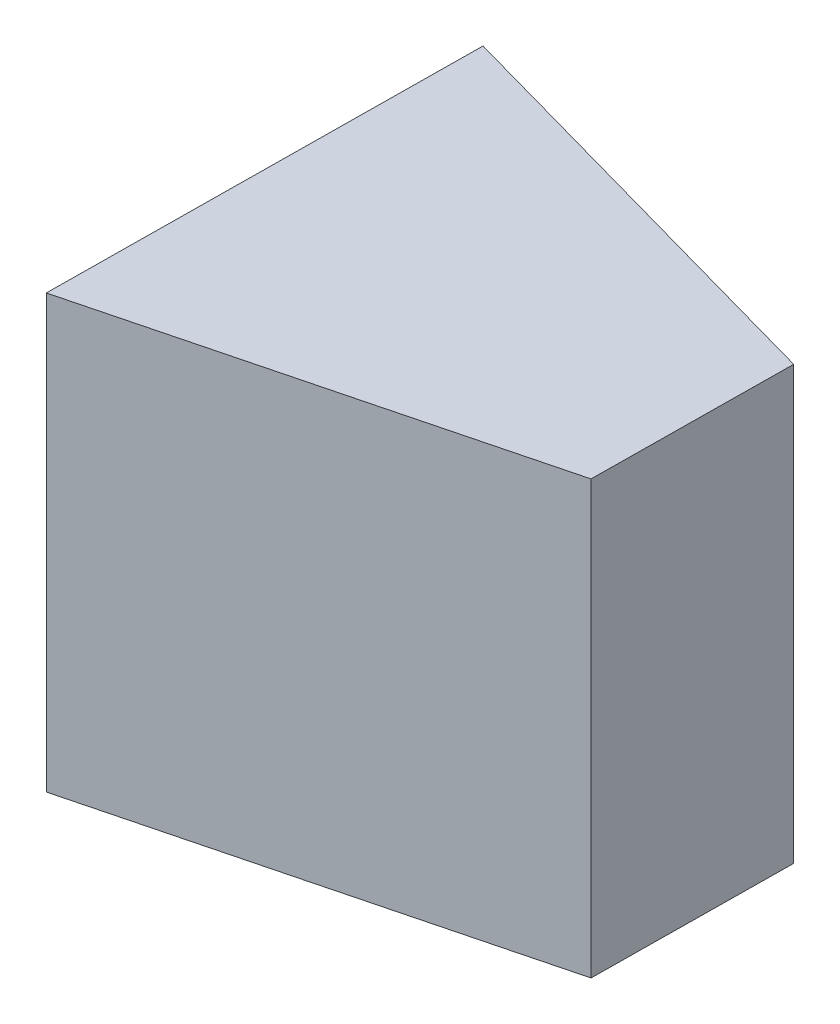
ISO-10303-21;
HEADER;
FILE_DESCRIPTION(('STEP AP214'),'2;1');
FILE_NAME('part.step','',(''),(''),'','','');
FILE_SCHEMA(('AUTOMOTIVE_DESIGN { 1 0 10303 214 1 1 1 1 }'));
ENDSEC;
DATA;
#1=APPLICATION_CONTEXT('core data for automotive mechanical design processes');
#2=APPLICATION_PROTOCOL_DEFINITION('international standard','automotive_design',2000,#1);
#3=PRODUCT_CONTEXT('',#1,'mechanical');
#4=PRODUCT('Part','Part','',(#3));
#5=PRODUCT_RELATED_PRODUCT_CATEGORY('part','',(#4));
#6=PRODUCT_DEFINITION_FORMATION('','',#4);
#7=PRODUCT_DEFINITION_CONTEXT('part definition',#1,'design');
#8=PRODUCT_DEFINITION('design','',#6,#7);
#9=PRODUCT_DEFINITION_SHAPE('','',#8);
#10=(LENGTH_UNIT() NAMED_UNIT(*) SI_UNIT(.MILLI.,.METRE.));
#11=(NAMED_UNIT(*) PLANE_ANGLE_UNIT() SI_UNIT($,.RADIAN.));
#12=(NAMED_UNIT(*) SI_UNIT($,.STERADIAN.) SOLID_ANGLE_UNIT());
#13=UNCERTAINTY_MEASURE_WITH_UNIT(LENGTH_MEASURE(1.E-05),#10,'distance_accuracy_value','');
#14=(GEOMETRIC_REPRESENTATION_CONTEXT(3) GLOBAL_UNCERTAINTY_ASSIGNED_CONTEXT((#13)) GLOBAL_UNIT_ASSIGNED_CONTEXT((#10,
#11,#12)) REPRESENTATION_CONTEXT('',''));
#15=CARTESIAN_POINT('',(0.,0.,0.));
#16=DIRECTION('',(0.,0.,1.));
#17=DIRECTION('',(1.,0.,0.));
#18=AXIS2_PLACEMENT_3D('',#15,#16,#17);
#19=CARTESIAN_POINT('',(24.7376919873646,50.,25.2595842233849));
#20=DIRECTION('',(-0.999945524214991,0.,-0.010437844720407));
#21=DIRECTION('',(-0.010437844720407,0.,0.999945524214991));
#22=AXIS2_PLACEMENT_3D('',#19,#20,#21);
#23=PLANE('',#22);
#24=DIRECTION('',(0.010437844720407,0.,-0.999945524214991));
#25=VECTOR('',#24,1.);
#26=CARTESIAN_POINT('',(24.7376919873646,0.,25.2595842233849));
#27=LINE('',#26,#25);
#28=CARTESIAN_POINT('',(24.8775325905423,0.,11.8628544389588));
#29=VERTEX_POINT('',#28);
#30=CARTESIAN_POINT('',(25.1197436202072,0.,-11.3409622029385));
#31=VERTEX_POINT('',#30);
#32=EDGE_CURVE('E103',#29,#31,#27,.T.);
#33=ORIENTED_EDGE('',*,*,#32,.T.);
#34=DIRECTION('',(0.,1.,0.));
#35=VECTOR('',#34,1.);
#36=CARTESIAN_POINT('',(25.1197436202072,50.,-11.3409622029385));
#37=LINE('',#36,#35);
#38=CARTESIAN_POINT('',(25.1197436202072,50.,-11.3409622029385));
#39=VERTEX_POINT('',#38);
#40=EDGE_CURVE('E11',#39,#31,#37,.F.);
#41=ORIENTED_EDGE('',*,*,#40,.F.);
#42=DIRECTION('',(0.010437844720407,0.,-0.999945524214991));
#43=VECTOR('',#42,1.);
#44=CARTESIAN_POINT('',(24.7376919873646,50.,25.2595842233849));
#45=LINE('',#44,#43);
#46=CARTESIAN_POINT('',(24.8775325905423,50.,11.8628544389588));
#47=VERTEX_POINT('',#46);
#48=EDGE_CURVE('E83',#47,#39,#45,.T.);
#49=ORIENTED_EDGE('',*,*,#48,.F.);
#50=DIRECTION('',(0.,1.,0.));
#51=VECTOR('',#50,1.);
#52=CARTESIAN_POINT('',(24.8775325905423,50.,11.8628544389588));
#53=LINE('',#52,#51);
#54=EDGE_CURVE('E43',#47,#29,#53,.F.);
#55=ORIENTED_EDGE('',*,*,#54,.T.);
#56=EDGE_LOOP('',(#33,#41,#49,#55));
#57=FACE_BOUND('',#56,.T.);
#58=ADVANCED_FACE('F39',(#57),#23,.F.);
#59=CARTESIAN_POINT('',(-24.7376919873646,50.,-25.2595842233849));
#60=DIRECTION('',(0.2688871295181,0.,-0.963171693717956));
#61=DIRECTION('',(-0.963171693717956,0.,-0.2688871295181));
#62=AXIS2_PLACEMENT_3D('',#59,#60,#61);
#63=PLANE('',#62);
#64=DIRECTION('',(0.963171693717956,0.,0.2688871295181));
#65=VECTOR('',#64,1.);
#66=CARTESIAN_POINT('',(-24.7376919873646,0.,-25.2595842233849));
#67=LINE('',#66,#65);
#68=CARTESIAN_POINT('',(-24.7376919873646,0.,-25.2595842233849));
#69=VERTEX_POINT('',#68);
#70=EDGE_CURVE('E90',#31,#69,#67,.F.);
#71=ORIENTED_EDGE('',*,*,#70,.T.);
#72=DIRECTION('',(0.,-1.,0.));
#73=VECTOR('',#72,1.);
#74=CARTESIAN_POINT('',(-24.7376919873646,50.,-25.2595842233849));
#75=LINE('',#74,#73);
#76=CARTESIAN_POINT('',(-24.7376919873646,50.,-25.2595842233849));
#77=VERTEX_POINT('',#76);
#78=EDGE_CURVE('E50',#77,#69,#75,.T.);
#79=ORIENTED_EDGE('',*,*,#78,.F.);
#80=DIRECTION('',(0.963171693717956,0.,0.2688871295181));
#81=VECTOR('',#80,1.);
#82=CARTESIAN_POINT('',(-24.7376919873646,50.,-25.2595842233849));
#83=LINE('',#82,#81);
#84=EDGE_CURVE('E76',#39,#77,#83,.F.);
#85=ORIENTED_EDGE('',*,*,#84,.F.);
#86=ORIENTED_EDGE('',*,*,#40,.T.);
#87=EDGE_LOOP('',(#71,#79,#85,#86));
#88=FACE_BOUND('',#87,.T.);
#89=ADVANCED_FACE('F89',(#88),#63,.T.);
#90=CARTESIAN_POINT('',(-24.7376919873646,50.,-25.2595842233849));
#91=DIRECTION('',(0.999945524214991,0.,0.0104378447204068));
#92=DIRECTION('',(0.0104378447204068,0.,-0.999945524214991));
#93=AXIS2_PLACEMENT_3D('',#90,#91,#92);
#94=PLANE('',#93);
#95=DIRECTION('',(-0.0104378447204068,0.,0.999945524214991));
#96=VECTOR('',#95,1.);
#97=CARTESIAN_POINT('',(-24.7376919873646,0.,-25.2595842233849));
#98=LINE('',#97,#96);
#99=CARTESIAN_POINT('',(-25.2595842233849,0.,24.7376919873646));
#100=VERTEX_POINT('',#99);
#101=EDGE_CURVE('E107',#69,#100,#98,.T.);
#102=ORIENTED_EDGE('',*,*,#101,.T.);
#103=DIRECTION('',(0.,-1.,0.));
#104=VECTOR('',#103,1.);
#105=CARTESIAN_POINT('',(-25.2595842233849,50.,24.7376919873646));
#106=LINE('',#105,#104);
#107=CARTESIAN_POINT('',(-25.2595842233849,50.,24.7376919873646));
#108=VERTEX_POINT('',#107);
#109=EDGE_CURVE('E94',#108,#100,#106,.T.);
#110=ORIENTED_EDGE('',*,*,#109,.F.);
#111=DIRECTION('',(-0.0104378447204068,0.,0.999945524214991));
#112=VECTOR('',#111,1.);
#113=CARTESIAN_POINT('',(-24.7376919873646,50.,-25.2595842233849));
#114=LINE('',#113,#112);
#115=EDGE_CURVE('E80',#77,#108,#114,.T.);
#116=ORIENTED_EDGE('',*,*,#115,.F.);
#117=ORIENTED_EDGE('',*,*,#78,.T.);
#118=EDGE_LOOP('',(#102,#110,#116,#117));
#119=FACE_BOUND('',#118,.T.);
#120=ADVANCED_FACE('F96',(#119),#94,.F.);
#121=CARTESIAN_POINT('',(-25.2595842233849,50.,24.7376919873646));
#122=DIRECTION('',(0.248722761945628,0.,0.968574719724885));
#123=DIRECTION('',(0.968574719724885,0.,-0.248722761945628));
#124=AXIS2_PLACEMENT_3D('',#121,#122,#123);
#125=PLANE('',#124);
#126=DIRECTION('',(-0.968574719724885,0.,0.248722761945628));
#127=VECTOR('',#126,1.);
#128=CARTESIAN_POINT('',(-25.2595842233849,0.,24.7376919873646));
#129=LINE('',#128,#127);
#130=EDGE_CURVE('E110',#100,#29,#129,.F.);
#131=ORIENTED_EDGE('',*,*,#130,.T.);
#132=ORIENTED_EDGE('',*,*,#54,.F.);
#133=DIRECTION('',(-0.968574719724885,0.,0.248722761945628));
#134=VECTOR('',#133,1.);
#135=CARTESIAN_POINT('',(-25.2595842233849,50.,24.7376919873646));
#136=LINE('',#135,#134);
#137=EDGE_CURVE('E58',#108,#47,#136,.F.);
#138=ORIENTED_EDGE('',*,*,#137,.F.);
#139=ORIENTED_EDGE('',*,*,#109,.T.);
#140=EDGE_LOOP('',(#131,#132,#138,#139));
#141=FACE_BOUND('',#140,.T.);
#142=ADVANCED_FACE('F41',(#141),#125,.T.);
#143=CARTESIAN_POINT('',(0.,50.,0.));
#144=DIRECTION('',(0.,1.,0.));
#145=DIRECTION('',(0.,0.,1.));
#146=AXIS2_PLACEMENT_3D('',#143,#144,#145);
#147=PLANE('',#146);
#148=ORIENTED_EDGE('',*,*,#48,.T.);
#149=ORIENTED_EDGE('',*,*,#84,.T.);
#150=ORIENTED_EDGE('',*,*,#115,.T.);
#151=ORIENTED_EDGE('',*,*,#137,.T.);
#152=EDGE_LOOP('',(#148,#149,#150,#151));
#153=FACE_BOUND('',#152,.T.);
#154=ADVANCED_FACE('F78',(#153),#147,.T.);
#155=CARTESIAN_POINT('',(0.,0.,0.));
#156=DIRECTION('',(0.,1.,0.));
#157=DIRECTION('',(0.,0.,1.));
#158=AXIS2_PLACEMENT_3D('',#155,#156,#157);
#159=PLANE('',#158);
#160=ORIENTED_EDGE('',*,*,#32,.F.);
#161=ORIENTED_EDGE('',*,*,#130,.F.);
#162=ORIENTED_EDGE('',*,*,#101,.F.);
#163=ORIENTED_EDGE('',*,*,#70,.F.);
#164=EDGE_LOOP('',(#160,#161,#162,#163));
#165=FACE_BOUND('',#164,.T.);
#166=ADVANCED_FACE('F125',(#165),#159,.F.);
#167=CLOSED_SHELL('',(#58,#89,#120,#142,#154,#166));
#168=MANIFOLD_SOLID_BREP('B2',#167);
#169=ADVANCED_BREP_SHAPE_REPRESENTATION('',(#18,#168),#14);
#170=SHAPE_DEFINITION_REPRESENTATION(#9,#169);
ENDSEC;
END-ISO-10303-21;
